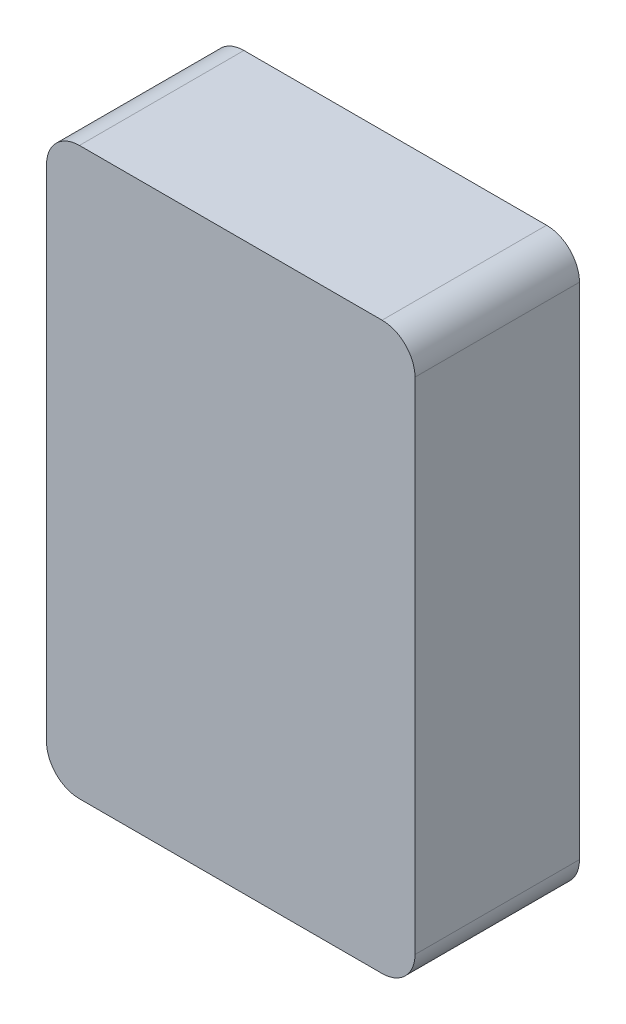
ISO-10303-21;
HEADER;
FILE_DESCRIPTION(('STEP AP214'),'2;1');
FILE_NAME('part.step','',(''),(''),'','','');
FILE_SCHEMA(('AUTOMOTIVE_DESIGN { 1 0 10303 214 1 1 1 1 }'));
ENDSEC;
DATA;
#1=APPLICATION_CONTEXT('core data for automotive mechanical design processes');
#2=APPLICATION_PROTOCOL_DEFINITION('international standard','automotive_design',2000,#1);
#3=PRODUCT_CONTEXT('',#1,'mechanical');
#4=PRODUCT('Part','Part','',(#3));
#5=PRODUCT_RELATED_PRODUCT_CATEGORY('part','',(#4));
#6=PRODUCT_DEFINITION_FORMATION('','',#4);
#7=PRODUCT_DEFINITION_CONTEXT('part definition',#1,'design');
#8=PRODUCT_DEFINITION('design','',#6,#7);
#9=PRODUCT_DEFINITION_SHAPE('','',#8);
#10=(LENGTH_UNIT() NAMED_UNIT(*) SI_UNIT(.MILLI.,.METRE.));
#11=(NAMED_UNIT(*) PLANE_ANGLE_UNIT() SI_UNIT($,.RADIAN.));
#12=(NAMED_UNIT(*) SI_UNIT($,.STERADIAN.) SOLID_ANGLE_UNIT());
#13=UNCERTAINTY_MEASURE_WITH_UNIT(LENGTH_MEASURE(1.E-05),#10,'distance_accuracy_value','');
#14=(GEOMETRIC_REPRESENTATION_CONTEXT(3) GLOBAL_UNCERTAINTY_ASSIGNED_CONTEXT((#13)) GLOBAL_UNIT_ASSIGNED_CONTEXT((#10,
#11,#12)) REPRESENTATION_CONTEXT('',''));
#15=CARTESIAN_POINT('',(0.,0.,0.));
#16=DIRECTION('',(0.,0.,1.));
#17=DIRECTION('',(1.,0.,0.));
#18=AXIS2_PLACEMENT_3D('',#15,#16,#17);
#19=CARTESIAN_POINT('',(-23.,-38.,25.));
#20=DIRECTION('',(0.,0.,-1.));
#21=DIRECTION('',(-1.,0.,0.));
#22=AXIS2_PLACEMENT_3D('',#19,#20,#21);
#23=CYLINDRICAL_SURFACE('',#22,5.);
#24=CARTESIAN_POINT('',(-23.,-38.,0.));
#25=DIRECTION('',(0.,0.,1.));
#26=DIRECTION('',(1.,0.,0.));
#27=AXIS2_PLACEMENT_3D('',#24,#25,#26);
#28=CIRCLE('',#27,5.);
#29=CARTESIAN_POINT('',(-28.,-38.,0.));
#30=VERTEX_POINT('',#29);
#31=CARTESIAN_POINT('',(-23.,-43.,0.));
#32=VERTEX_POINT('',#31);
#33=EDGE_CURVE('E133',#30,#32,#28,.T.);
#34=ORIENTED_EDGE('',*,*,#33,.T.);
#35=DIRECTION('',(0.,0.,-1.));
#36=VECTOR('',#35,1.);
#37=CARTESIAN_POINT('',(-23.,-43.,25.));
#38=LINE('',#37,#36);
#39=CARTESIAN_POINT('',(-23.,-43.,25.));
#40=VERTEX_POINT('',#39);
#41=EDGE_CURVE('E11',#40,#32,#38,.T.);
#42=ORIENTED_EDGE('',*,*,#41,.F.);
#43=CARTESIAN_POINT('',(-23.,-38.,25.));
#44=DIRECTION('',(0.,0.,1.));
#45=DIRECTION('',(1.,0.,0.));
#46=AXIS2_PLACEMENT_3D('',#43,#44,#45);
#47=CIRCLE('',#46,5.);
#48=CARTESIAN_POINT('',(-28.,-38.,25.));
#49=VERTEX_POINT('',#48);
#50=EDGE_CURVE('E147',#49,#40,#47,.T.);
#51=ORIENTED_EDGE('',*,*,#50,.F.);
#52=DIRECTION('',(0.,0.,-1.));
#53=VECTOR('',#52,1.);
#54=CARTESIAN_POINT('',(-28.,-38.,25.));
#55=LINE('',#54,#53);
#56=EDGE_CURVE('E129',#49,#30,#55,.T.);
#57=ORIENTED_EDGE('',*,*,#56,.T.);
#58=EDGE_LOOP('',(#34,#42,#51,#57));
#59=FACE_BOUND('',#58,.T.);
#60=ADVANCED_FACE('F37',(#59),#23,.T.);
#61=CARTESIAN_POINT('',(-23.,-43.,25.));
#62=DIRECTION('',(0.,1.,0.));
#63=DIRECTION('',(0.,0.,1.));
#64=AXIS2_PLACEMENT_3D('',#61,#62,#63);
#65=PLANE('',#64);
#66=DIRECTION('',(1.,0.,0.));
#67=VECTOR('',#66,1.);
#68=CARTESIAN_POINT('',(-23.,-43.,0.));
#69=LINE('',#68,#67);
#70=CARTESIAN_POINT('',(23.,-43.,0.));
#71=VERTEX_POINT('',#70);
#72=EDGE_CURVE('E136',#32,#71,#69,.T.);
#73=ORIENTED_EDGE('',*,*,#72,.T.);
#74=DIRECTION('',(0.,0.,-1.));
#75=VECTOR('',#74,1.);
#76=CARTESIAN_POINT('',(23.,-43.,25.));
#77=LINE('',#76,#75);
#78=CARTESIAN_POINT('',(23.,-43.,25.));
#79=VERTEX_POINT('',#78);
#80=EDGE_CURVE('E45',#79,#71,#77,.T.);
#81=ORIENTED_EDGE('',*,*,#80,.F.);
#82=DIRECTION('',(1.,0.,0.));
#83=VECTOR('',#82,1.);
#84=CARTESIAN_POINT('',(-23.,-43.,25.));
#85=LINE('',#84,#83);
#86=EDGE_CURVE('E96',#40,#79,#85,.T.);
#87=ORIENTED_EDGE('',*,*,#86,.F.);
#88=ORIENTED_EDGE('',*,*,#41,.T.);
#89=EDGE_LOOP('',(#73,#81,#87,#88));
#90=FACE_BOUND('',#89,.T.);
#91=ADVANCED_FACE('F182',(#90),#65,.F.);
#92=CARTESIAN_POINT('',(23.,-38.,25.));
#93=DIRECTION('',(0.,0.,-1.));
#94=DIRECTION('',(-1.,0.,0.));
#95=AXIS2_PLACEMENT_3D('',#92,#93,#94);
#96=CYLINDRICAL_SURFACE('',#95,5.);
#97=CARTESIAN_POINT('',(23.,-38.,0.));
#98=DIRECTION('',(0.,0.,1.));
#99=DIRECTION('',(1.,0.,0.));
#100=AXIS2_PLACEMENT_3D('',#97,#98,#99);
#101=CIRCLE('',#100,5.);
#102=CARTESIAN_POINT('',(28.,-38.,0.));
#103=VERTEX_POINT('',#102);
#104=EDGE_CURVE('E138',#71,#103,#101,.T.);
#105=ORIENTED_EDGE('',*,*,#104,.T.);
#106=DIRECTION('',(0.,0.,-1.));
#107=VECTOR('',#106,1.);
#108=CARTESIAN_POINT('',(28.,-38.,25.));
#109=LINE('',#108,#107);
#110=CARTESIAN_POINT('',(28.,-38.,25.));
#111=VERTEX_POINT('',#110);
#112=EDGE_CURVE('E154',#111,#103,#109,.T.);
#113=ORIENTED_EDGE('',*,*,#112,.F.);
#114=CARTESIAN_POINT('',(23.,-38.,25.));
#115=DIRECTION('',(0.,0.,1.));
#116=DIRECTION('',(1.,0.,0.));
#117=AXIS2_PLACEMENT_3D('',#114,#115,#116);
#118=CIRCLE('',#117,5.);
#119=EDGE_CURVE('E162',#79,#111,#118,.T.);
#120=ORIENTED_EDGE('',*,*,#119,.F.);
#121=ORIENTED_EDGE('',*,*,#80,.T.);
#122=EDGE_LOOP('',(#105,#113,#120,#121));
#123=FACE_BOUND('',#122,.T.);
#124=ADVANCED_FACE('F160',(#123),#96,.T.);
#125=CARTESIAN_POINT('',(28.,38.,25.));
#126=DIRECTION('',(-1.,0.,0.));
#127=DIRECTION('',(0.,-1.,0.));
#128=AXIS2_PLACEMENT_3D('',#125,#126,#127);
#129=PLANE('',#128);
#130=DIRECTION('',(0.,1.,0.));
#131=VECTOR('',#130,1.);
#132=CARTESIAN_POINT('',(28.,38.,0.));
#133=LINE('',#132,#131);
#134=CARTESIAN_POINT('',(28.,38.,0.));
#135=VERTEX_POINT('',#134);
#136=EDGE_CURVE('E140',#103,#135,#133,.T.);
#137=ORIENTED_EDGE('',*,*,#136,.T.);
#138=DIRECTION('',(0.,0.,-1.));
#139=VECTOR('',#138,1.);
#140=CARTESIAN_POINT('',(28.,38.,25.));
#141=LINE('',#140,#139);
#142=CARTESIAN_POINT('',(28.,38.,25.));
#143=VERTEX_POINT('',#142);
#144=EDGE_CURVE('E151',#143,#135,#141,.T.);
#145=ORIENTED_EDGE('',*,*,#144,.F.);
#146=DIRECTION('',(0.,1.,0.));
#147=VECTOR('',#146,1.);
#148=CARTESIAN_POINT('',(28.,38.,25.));
#149=LINE('',#148,#147);
#150=EDGE_CURVE('E174',#111,#143,#149,.T.);
#151=ORIENTED_EDGE('',*,*,#150,.F.);
#152=ORIENTED_EDGE('',*,*,#112,.T.);
#153=EDGE_LOOP('',(#137,#145,#151,#152));
#154=FACE_BOUND('',#153,.T.);
#155=ADVANCED_FACE('F170',(#154),#129,.F.);
#156=CARTESIAN_POINT('',(23.,38.,25.));
#157=DIRECTION('',(0.,0.,-1.));
#158=DIRECTION('',(-1.,0.,0.));
#159=AXIS2_PLACEMENT_3D('',#156,#157,#158);
#160=CYLINDRICAL_SURFACE('',#159,5.);
#161=CARTESIAN_POINT('',(23.,38.,0.));
#162=DIRECTION('',(0.,0.,1.));
#163=DIRECTION('',(-1.,0.,0.));
#164=AXIS2_PLACEMENT_3D('',#161,#162,#163);
#165=CIRCLE('',#164,5.);
#166=CARTESIAN_POINT('',(23.,43.,0.));
#167=VERTEX_POINT('',#166);
#168=EDGE_CURVE('E142',#135,#167,#165,.T.);
#169=ORIENTED_EDGE('',*,*,#168,.T.);
#170=DIRECTION('',(0.,0.,-1.));
#171=VECTOR('',#170,1.);
#172=CARTESIAN_POINT('',(23.,43.,25.));
#173=LINE('',#172,#171);
#174=CARTESIAN_POINT('',(23.,43.,25.));
#175=VERTEX_POINT('',#174);
#176=EDGE_CURVE('E124',#175,#167,#173,.T.);
#177=ORIENTED_EDGE('',*,*,#176,.F.);
#178=CARTESIAN_POINT('',(23.,38.,25.));
#179=DIRECTION('',(0.,0.,1.));
#180=DIRECTION('',(-1.,0.,0.));
#181=AXIS2_PLACEMENT_3D('',#178,#179,#180);
#182=CIRCLE('',#181,5.);
#183=EDGE_CURVE('E115',#143,#175,#182,.T.);
#184=ORIENTED_EDGE('',*,*,#183,.F.);
#185=ORIENTED_EDGE('',*,*,#144,.T.);
#186=EDGE_LOOP('',(#169,#177,#184,#185));
#187=FACE_BOUND('',#186,.T.);
#188=ADVANCED_FACE('F173',(#187),#160,.T.);
#189=CARTESIAN_POINT('',(-23.,43.,25.));
#190=DIRECTION('',(0.,-1.,0.));
#191=DIRECTION('',(0.,0.,-1.));
#192=AXIS2_PLACEMENT_3D('',#189,#190,#191);
#193=PLANE('',#192);
#194=DIRECTION('',(-1.,0.,0.));
#195=VECTOR('',#194,1.);
#196=CARTESIAN_POINT('',(-23.,43.,0.));
#197=LINE('',#196,#195);
#198=CARTESIAN_POINT('',(-23.,43.,0.));
#199=VERTEX_POINT('',#198);
#200=EDGE_CURVE('E123',#167,#199,#197,.T.);
#201=ORIENTED_EDGE('',*,*,#200,.T.);
#202=DIRECTION('',(0.,0.,-1.));
#203=VECTOR('',#202,1.);
#204=CARTESIAN_POINT('',(-23.,43.,25.));
#205=LINE('',#204,#203);
#206=CARTESIAN_POINT('',(-23.,43.,25.));
#207=VERTEX_POINT('',#206);
#208=EDGE_CURVE('E120',#207,#199,#205,.T.);
#209=ORIENTED_EDGE('',*,*,#208,.F.);
#210=DIRECTION('',(-1.,0.,0.));
#211=VECTOR('',#210,1.);
#212=CARTESIAN_POINT('',(-23.,43.,25.));
#213=LINE('',#212,#211);
#214=EDGE_CURVE('E109',#175,#207,#213,.T.);
#215=ORIENTED_EDGE('',*,*,#214,.F.);
#216=ORIENTED_EDGE('',*,*,#176,.T.);
#217=EDGE_LOOP('',(#201,#209,#215,#216));
#218=FACE_BOUND('',#217,.T.);
#219=ADVANCED_FACE('F121',(#218),#193,.F.);
#220=CARTESIAN_POINT('',(-23.,38.,25.));
#221=DIRECTION('',(0.,0.,-1.));
#222=DIRECTION('',(-1.,0.,0.));
#223=AXIS2_PLACEMENT_3D('',#220,#221,#222);
#224=CYLINDRICAL_SURFACE('',#223,5.);
#225=CARTESIAN_POINT('',(-23.,38.,0.));
#226=DIRECTION('',(0.,0.,1.));
#227=DIRECTION('',(1.,0.,0.));
#228=AXIS2_PLACEMENT_3D('',#225,#226,#227);
#229=CIRCLE('',#228,5.);
#230=CARTESIAN_POINT('',(-28.,38.,0.));
#231=VERTEX_POINT('',#230);
#232=EDGE_CURVE('E82',#199,#231,#229,.T.);
#233=ORIENTED_EDGE('',*,*,#232,.T.);
#234=DIRECTION('',(0.,0.,-1.));
#235=VECTOR('',#234,1.);
#236=CARTESIAN_POINT('',(-28.,38.,25.));
#237=LINE('',#236,#235);
#238=CARTESIAN_POINT('',(-28.,38.,25.));
#239=VERTEX_POINT('',#238);
#240=EDGE_CURVE('E125',#239,#231,#237,.T.);
#241=ORIENTED_EDGE('',*,*,#240,.F.);
#242=CARTESIAN_POINT('',(-23.,38.,25.));
#243=DIRECTION('',(0.,0.,1.));
#244=DIRECTION('',(1.,0.,0.));
#245=AXIS2_PLACEMENT_3D('',#242,#243,#244);
#246=CIRCLE('',#245,5.);
#247=EDGE_CURVE('E113',#207,#239,#246,.T.);
#248=ORIENTED_EDGE('',*,*,#247,.F.);
#249=ORIENTED_EDGE('',*,*,#208,.T.);
#250=EDGE_LOOP('',(#233,#241,#248,#249));
#251=FACE_BOUND('',#250,.T.);
#252=ADVANCED_FACE('F127',(#251),#224,.T.);
#253=CARTESIAN_POINT('',(-28.,38.,25.));
#254=DIRECTION('',(1.,0.,0.));
#255=DIRECTION('',(0.,1.,0.));
#256=AXIS2_PLACEMENT_3D('',#253,#254,#255);
#257=PLANE('',#256);
#258=DIRECTION('',(0.,-1.,0.));
#259=VECTOR('',#258,1.);
#260=CARTESIAN_POINT('',(-28.,38.,0.));
#261=LINE('',#260,#259);
#262=EDGE_CURVE('E88',#231,#30,#261,.T.);
#263=ORIENTED_EDGE('',*,*,#262,.T.);
#264=ORIENTED_EDGE('',*,*,#56,.F.);
#265=DIRECTION('',(0.,-1.,0.));
#266=VECTOR('',#265,1.);
#267=CARTESIAN_POINT('',(-28.,38.,25.));
#268=LINE('',#267,#266);
#269=EDGE_CURVE('E53',#239,#49,#268,.T.);
#270=ORIENTED_EDGE('',*,*,#269,.F.);
#271=ORIENTED_EDGE('',*,*,#240,.T.);
#272=EDGE_LOOP('',(#263,#264,#270,#271));
#273=FACE_BOUND('',#272,.T.);
#274=ADVANCED_FACE('F198',(#273),#257,.F.);
#275=CARTESIAN_POINT('',(-23.,-38.,25.));
#276=DIRECTION('',(0.,0.,1.));
#277=DIRECTION('',(1.,0.,0.));
#278=AXIS2_PLACEMENT_3D('',#275,#276,#277);
#279=PLANE('',#278);
#280=ORIENTED_EDGE('',*,*,#50,.T.);
#281=ORIENTED_EDGE('',*,*,#86,.T.);
#282=ORIENTED_EDGE('',*,*,#119,.T.);
#283=ORIENTED_EDGE('',*,*,#150,.T.);
#284=ORIENTED_EDGE('',*,*,#183,.T.);
#285=ORIENTED_EDGE('',*,*,#214,.T.);
#286=ORIENTED_EDGE('',*,*,#247,.T.);
#287=ORIENTED_EDGE('',*,*,#269,.T.);
#288=EDGE_LOOP('',(#280,#281,#282,#283,#284,#285,#286,#287));
#289=FACE_BOUND('',#288,.T.);
#290=ADVANCED_FACE('F111',(#289),#279,.T.);
#291=CARTESIAN_POINT('',(-23.,-38.,0.));
#292=DIRECTION('',(0.,0.,1.));
#293=DIRECTION('',(1.,0.,0.));
#294=AXIS2_PLACEMENT_3D('',#291,#292,#293);
#295=PLANE('',#294);
#296=ORIENTED_EDGE('',*,*,#33,.F.);
#297=ORIENTED_EDGE('',*,*,#262,.F.);
#298=ORIENTED_EDGE('',*,*,#232,.F.);
#299=ORIENTED_EDGE('',*,*,#200,.F.);
#300=ORIENTED_EDGE('',*,*,#168,.F.);
#301=ORIENTED_EDGE('',*,*,#136,.F.);
#302=ORIENTED_EDGE('',*,*,#104,.F.);
#303=ORIENTED_EDGE('',*,*,#72,.F.);
#304=EDGE_LOOP('',(#296,#297,#298,#299,#300,#301,#302,#303));
#305=FACE_BOUND('',#304,.T.);
#306=ADVANCED_FACE('F166',(#305),#295,.F.);
#307=CLOSED_SHELL('',(#60,#91,#124,#155,#188,#219,#252,#274,#290,#306));
#308=MANIFOLD_SOLID_BREP('B2',#307);
#309=ADVANCED_BREP_SHAPE_REPRESENTATION('',(#18,#308),#14);
#310=SHAPE_DEFINITION_REPRESENTATION(#9,#309);
ENDSEC;
END-ISO-10303-21;
